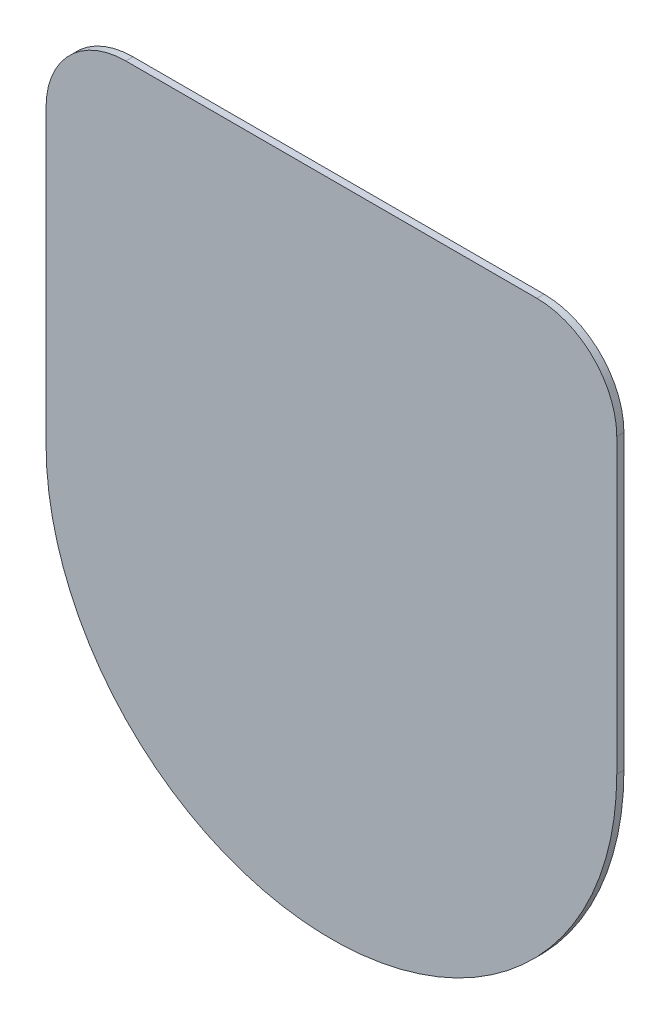
ISO-10303-21;
HEADER;
FILE_DESCRIPTION(('STEP AP214'),'2;1');
FILE_NAME('part.step','',(''),(''),'','','');
FILE_SCHEMA(('AUTOMOTIVE_DESIGN { 1 0 10303 214 1 1 1 1 }'));
ENDSEC;
DATA;
#1=APPLICATION_CONTEXT('core data for automotive mechanical design processes');
#2=APPLICATION_PROTOCOL_DEFINITION('international standard','automotive_design',2000,#1);
#3=PRODUCT_CONTEXT('',#1,'mechanical');
#4=PRODUCT('Part','Part','',(#3));
#5=PRODUCT_RELATED_PRODUCT_CATEGORY('part','',(#4));
#6=PRODUCT_DEFINITION_FORMATION('','',#4);
#7=PRODUCT_DEFINITION_CONTEXT('part definition',#1,'design');
#8=PRODUCT_DEFINITION('design','',#6,#7);
#9=PRODUCT_DEFINITION_SHAPE('','',#8);
#10=(LENGTH_UNIT() NAMED_UNIT(*) SI_UNIT(.MILLI.,.METRE.));
#11=(NAMED_UNIT(*) PLANE_ANGLE_UNIT() SI_UNIT($,.RADIAN.));
#12=(NAMED_UNIT(*) SI_UNIT($,.STERADIAN.) SOLID_ANGLE_UNIT());
#13=UNCERTAINTY_MEASURE_WITH_UNIT(LENGTH_MEASURE(1.E-05),#10,'distance_accuracy_value','');
#14=(GEOMETRIC_REPRESENTATION_CONTEXT(3) GLOBAL_UNCERTAINTY_ASSIGNED_CONTEXT((#13)) GLOBAL_UNIT_ASSIGNED_CONTEXT((#10,
#11,#12)) REPRESENTATION_CONTEXT('',''));
#15=CARTESIAN_POINT('',(0.,0.,0.));
#16=DIRECTION('',(0.,0.,1.));
#17=DIRECTION('',(1.,0.,0.));
#18=AXIS2_PLACEMENT_3D('',#15,#16,#17);
#19=CARTESIAN_POINT('',(-2.557953848736E-13,-445.,475.));
#20=DIRECTION('',(0.,0.,-1.));
#21=DIRECTION('',(0.,-1.,0.));
#22=AXIS2_PLACEMENT_3D('',#19,#20,#21);
#23=PLANE('',#22);
#24=DIRECTION('',(0.,1.,0.));
#25=VECTOR('',#24,1.);
#26=CARTESIAN_POINT('',(-159.,-445.,475.));
#27=LINE('',#26,#25);
#28=CARTESIAN_POINT('',(-159.,-445.,475.));
#29=VERTEX_POINT('',#28);
#30=CARTESIAN_POINT('',(-159.,-282.,475.));
#31=VERTEX_POINT('',#30);
#32=EDGE_CURVE('E110',#29,#31,#27,.T.);
#33=ORIENTED_EDGE('',*,*,#32,.F.);
#34=CARTESIAN_POINT('',(-2.557953848736E-13,-445.,475.));
#35=DIRECTION('',(0.,0.,-1.));
#36=DIRECTION('',(1.,0.,0.));
#37=AXIS2_PLACEMENT_3D('',#34,#35,#36);
#38=CIRCLE('',#37,159.);
#39=CARTESIAN_POINT('',(159.,-445.,475.));
#40=VERTEX_POINT('',#39);
#41=EDGE_CURVE('E36',#40,#29,#38,.T.);
#42=ORIENTED_EDGE('',*,*,#41,.F.);
#43=DIRECTION('',(0.,-1.,0.));
#44=VECTOR('',#43,1.);
#45=CARTESIAN_POINT('',(159.,-282.,475.));
#46=LINE('',#45,#44);
#47=CARTESIAN_POINT('',(159.,-282.,475.));
#48=VERTEX_POINT('',#47);
#49=EDGE_CURVE('E114',#48,#40,#46,.T.);
#50=ORIENTED_EDGE('',*,*,#49,.F.);
#51=CARTESIAN_POINT('',(114.5,-282.,475.));
#52=DIRECTION('',(0.,0.,1.));
#53=DIRECTION('',(1.,0.,0.));
#54=AXIS2_PLACEMENT_3D('',#51,#52,#53);
#55=CIRCLE('',#54,44.5);
#56=CARTESIAN_POINT('',(114.5,-237.5,475.));
#57=VERTEX_POINT('',#56);
#58=EDGE_CURVE('E11',#48,#57,#55,.T.);
#59=ORIENTED_EDGE('',*,*,#58,.T.);
#60=DIRECTION('',(1.,0.,0.));
#61=VECTOR('',#60,1.);
#62=CARTESIAN_POINT('',(-114.5,-237.5,475.));
#63=LINE('',#62,#61);
#64=CARTESIAN_POINT('',(-114.5,-237.5,475.));
#65=VERTEX_POINT('',#64);
#66=EDGE_CURVE('E87',#65,#57,#63,.T.);
#67=ORIENTED_EDGE('',*,*,#66,.F.);
#68=CARTESIAN_POINT('',(-114.5,-282.,475.));
#69=DIRECTION('',(0.,0.,1.));
#70=DIRECTION('',(0.,1.,0.));
#71=AXIS2_PLACEMENT_3D('',#68,#69,#70);
#72=CIRCLE('',#71,44.5);
#73=EDGE_CURVE('E27',#65,#31,#72,.T.);
#74=ORIENTED_EDGE('',*,*,#73,.T.);
#75=EDGE_LOOP('',(#33,#42,#50,#59,#67,#74));
#76=FACE_BOUND('',#75,.T.);
#77=ADVANCED_FACE('F17',(#76),#23,.F.);
#78=CARTESIAN_POINT('',(-114.5,-282.,470.84352));
#79=DIRECTION('',(0.,0.,1.));
#80=DIRECTION('',(0.,1.,0.));
#81=AXIS2_PLACEMENT_3D('',#78,#79,#80);
#82=CYLINDRICAL_SURFACE('',#81,44.5);
#83=ORIENTED_EDGE('',*,*,#73,.F.);
#84=DIRECTION('',(0.,0.,1.));
#85=VECTOR('',#84,1.);
#86=CARTESIAN_POINT('',(-114.5,-237.5,471.));
#87=LINE('',#86,#85);
#88=CARTESIAN_POINT('',(-114.5,-237.5,471.));
#89=VERTEX_POINT('',#88);
#90=EDGE_CURVE('E83',#89,#65,#87,.T.);
#91=ORIENTED_EDGE('',*,*,#90,.F.);
#92=CARTESIAN_POINT('',(-114.5,-282.,471.));
#93=DIRECTION('',(0.,0.,-1.));
#94=DIRECTION('',(-1.,0.,0.));
#95=AXIS2_PLACEMENT_3D('',#92,#93,#94);
#96=CIRCLE('',#95,44.5);
#97=CARTESIAN_POINT('',(-159.,-282.,471.));
#98=VERTEX_POINT('',#97);
#99=EDGE_CURVE('E70',#98,#89,#96,.T.);
#100=ORIENTED_EDGE('',*,*,#99,.F.);
#101=DIRECTION('',(0.,0.,1.));
#102=VECTOR('',#101,1.);
#103=CARTESIAN_POINT('',(-159.,-282.,471.));
#104=LINE('',#103,#102);
#105=EDGE_CURVE('E100',#98,#31,#104,.T.);
#106=ORIENTED_EDGE('',*,*,#105,.T.);
#107=EDGE_LOOP('',(#83,#91,#100,#106));
#108=FACE_BOUND('',#107,.T.);
#109=ADVANCED_FACE('F84',(#108),#82,.T.);
#110=CARTESIAN_POINT('',(-159.,-445.,475.));
#111=DIRECTION('',(-1.,0.,0.));
#112=DIRECTION('',(0.,0.,1.));
#113=AXIS2_PLACEMENT_3D('',#110,#111,#112);
#114=PLANE('',#113);
#115=DIRECTION('',(0.,1.,0.));
#116=VECTOR('',#115,1.);
#117=CARTESIAN_POINT('',(-159.,-445.,471.));
#118=LINE('',#117,#116);
#119=CARTESIAN_POINT('',(-159.,-445.,471.));
#120=VERTEX_POINT('',#119);
#121=EDGE_CURVE('E79',#120,#98,#118,.T.);
#122=ORIENTED_EDGE('',*,*,#121,.F.);
#123=DIRECTION('',(0.,0.,-1.));
#124=VECTOR('',#123,1.);
#125=CARTESIAN_POINT('',(-159.,-445.,475.));
#126=LINE('',#125,#124);
#127=EDGE_CURVE('E109',#29,#120,#126,.T.);
#128=ORIENTED_EDGE('',*,*,#127,.F.);
#129=ORIENTED_EDGE('',*,*,#32,.T.);
#130=ORIENTED_EDGE('',*,*,#105,.F.);
#131=EDGE_LOOP('',(#122,#128,#129,#130));
#132=FACE_BOUND('',#131,.T.);
#133=ADVANCED_FACE('F118',(#132),#114,.T.);
#134=CARTESIAN_POINT('',(-2.557953848736E-13,-445.,475.));
#135=DIRECTION('',(0.,0.,-1.));
#136=DIRECTION('',(0.,-1.,0.));
#137=AXIS2_PLACEMENT_3D('',#134,#135,#136);
#138=CYLINDRICAL_SURFACE('',#137,159.);
#139=ORIENTED_EDGE('',*,*,#127,.T.);
#140=CARTESIAN_POINT('',(-2.557953848736E-13,-445.,471.));
#141=DIRECTION('',(0.,0.,-1.));
#142=DIRECTION('',(1.,0.,0.));
#143=AXIS2_PLACEMENT_3D('',#140,#141,#142);
#144=CIRCLE('',#143,159.);
#145=CARTESIAN_POINT('',(159.,-445.,471.));
#146=VERTEX_POINT('',#145);
#147=EDGE_CURVE('E103',#146,#120,#144,.T.);
#148=ORIENTED_EDGE('',*,*,#147,.F.);
#149=DIRECTION('',(0.,0.,-1.));
#150=VECTOR('',#149,1.);
#151=CARTESIAN_POINT('',(159.,-445.,475.));
#152=LINE('',#151,#150);
#153=EDGE_CURVE('E98',#40,#146,#152,.T.);
#154=ORIENTED_EDGE('',*,*,#153,.F.);
#155=ORIENTED_EDGE('',*,*,#41,.T.);
#156=EDGE_LOOP('',(#139,#148,#154,#155));
#157=FACE_BOUND('',#156,.T.);
#158=ADVANCED_FACE('F127',(#157),#138,.T.);
#159=CARTESIAN_POINT('',(159.,-237.5,475.));
#160=DIRECTION('',(1.,0.,0.));
#161=DIRECTION('',(0.,-1.,0.));
#162=AXIS2_PLACEMENT_3D('',#159,#160,#161);
#163=PLANE('',#162);
#164=ORIENTED_EDGE('',*,*,#49,.T.);
#165=ORIENTED_EDGE('',*,*,#153,.T.);
#166=DIRECTION('',(0.,-1.,0.));
#167=VECTOR('',#166,1.);
#168=CARTESIAN_POINT('',(159.,-282.,471.));
#169=LINE('',#168,#167);
#170=CARTESIAN_POINT('',(159.,-282.,471.));
#171=VERTEX_POINT('',#170);
#172=EDGE_CURVE('E94',#171,#146,#169,.T.);
#173=ORIENTED_EDGE('',*,*,#172,.F.);
#174=DIRECTION('',(0.,0.,1.));
#175=VECTOR('',#174,1.);
#176=CARTESIAN_POINT('',(159.,-282.,471.));
#177=LINE('',#176,#175);
#178=EDGE_CURVE('E105',#171,#48,#177,.T.);
#179=ORIENTED_EDGE('',*,*,#178,.T.);
#180=EDGE_LOOP('',(#164,#165,#173,#179));
#181=FACE_BOUND('',#180,.T.);
#182=ADVANCED_FACE('F126',(#181),#163,.T.);
#183=CARTESIAN_POINT('',(114.5,-282.,470.84352));
#184=DIRECTION('',(0.,0.,1.));
#185=DIRECTION('',(1.,0.,0.));
#186=AXIS2_PLACEMENT_3D('',#183,#184,#185);
#187=CYLINDRICAL_SURFACE('',#186,44.5);
#188=ORIENTED_EDGE('',*,*,#58,.F.);
#189=ORIENTED_EDGE('',*,*,#178,.F.);
#190=CARTESIAN_POINT('',(114.5,-282.,471.));
#191=DIRECTION('',(0.,0.,-1.));
#192=DIRECTION('',(0.,1.,0.));
#193=AXIS2_PLACEMENT_3D('',#190,#191,#192);
#194=CIRCLE('',#193,44.5);
#195=CARTESIAN_POINT('',(114.5,-237.5,471.));
#196=VERTEX_POINT('',#195);
#197=EDGE_CURVE('E92',#196,#171,#194,.T.);
#198=ORIENTED_EDGE('',*,*,#197,.F.);
#199=DIRECTION('',(0.,0.,1.));
#200=VECTOR('',#199,1.);
#201=CARTESIAN_POINT('',(114.5,-237.5,471.));
#202=LINE('',#201,#200);
#203=EDGE_CURVE('E21',#196,#57,#202,.T.);
#204=ORIENTED_EDGE('',*,*,#203,.T.);
#205=EDGE_LOOP('',(#188,#189,#198,#204));
#206=FACE_BOUND('',#205,.T.);
#207=ADVANCED_FACE('F123',(#206),#187,.T.);
#208=CARTESIAN_POINT('',(-159.,-237.5,475.));
#209=DIRECTION('',(0.,1.,0.));
#210=DIRECTION('',(1.,0.,0.));
#211=AXIS2_PLACEMENT_3D('',#208,#209,#210);
#212=PLANE('',#211);
#213=ORIENTED_EDGE('',*,*,#66,.T.);
#214=ORIENTED_EDGE('',*,*,#203,.F.);
#215=DIRECTION('',(1.,0.,0.));
#216=VECTOR('',#215,1.);
#217=CARTESIAN_POINT('',(-114.5,-237.5,471.));
#218=LINE('',#217,#216);
#219=EDGE_CURVE('E77',#89,#196,#218,.T.);
#220=ORIENTED_EDGE('',*,*,#219,.F.);
#221=ORIENTED_EDGE('',*,*,#90,.T.);
#222=EDGE_LOOP('',(#213,#214,#220,#221));
#223=FACE_BOUND('',#222,.T.);
#224=ADVANCED_FACE('F90',(#223),#212,.T.);
#225=CARTESIAN_POINT('',(-2.557953848736E-13,-445.,471.));
#226=DIRECTION('',(0.,0.,-1.));
#227=DIRECTION('',(0.,-1.,0.));
#228=AXIS2_PLACEMENT_3D('',#225,#226,#227);
#229=PLANE('',#228);
#230=ORIENTED_EDGE('',*,*,#219,.T.);
#231=ORIENTED_EDGE('',*,*,#197,.T.);
#232=ORIENTED_EDGE('',*,*,#172,.T.);
#233=ORIENTED_EDGE('',*,*,#147,.T.);
#234=ORIENTED_EDGE('',*,*,#121,.T.);
#235=ORIENTED_EDGE('',*,*,#99,.T.);
#236=EDGE_LOOP('',(#230,#231,#232,#233,#234,#235));
#237=FACE_BOUND('',#236,.T.);
#238=ADVANCED_FACE('F19',(#237),#229,.T.);
#239=CLOSED_SHELL('',(#77,#109,#133,#158,#182,#207,#224,#238));
#240=MANIFOLD_SOLID_BREP('B1',#239);
#241=ADVANCED_BREP_SHAPE_REPRESENTATION('',(#18,#240),#14);
#242=SHAPE_DEFINITION_REPRESENTATION(#9,#241);
ENDSEC;
END-ISO-10303-21;
